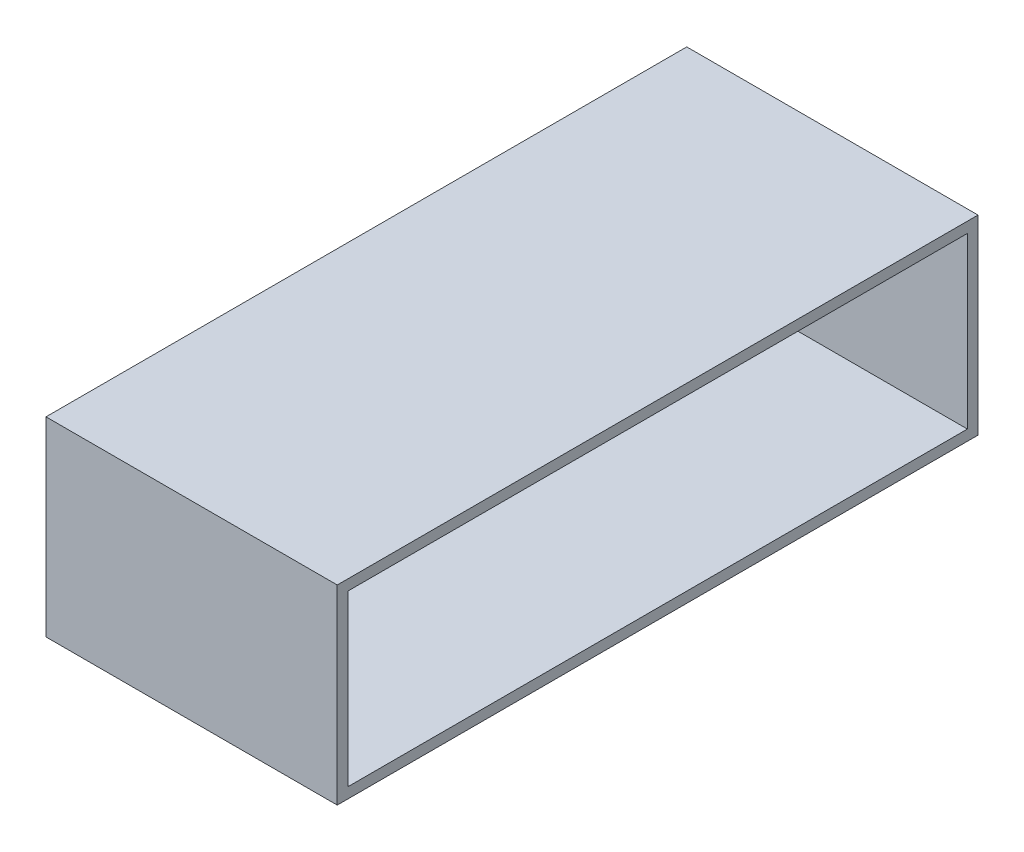
ISO-10303-21;
HEADER;
FILE_DESCRIPTION(('STEP AP214'),'2;1');
FILE_NAME('part.step','',(''),(''),'','','');
FILE_SCHEMA(('AUTOMOTIVE_DESIGN { 1 0 10303 214 1 1 1 1 }'));
ENDSEC;
DATA;
#1=APPLICATION_CONTEXT('core data for automotive mechanical design processes');
#2=APPLICATION_PROTOCOL_DEFINITION('international standard','automotive_design',2000,#1);
#3=PRODUCT_CONTEXT('',#1,'mechanical');
#4=PRODUCT('Part','Part','',(#3));
#5=PRODUCT_RELATED_PRODUCT_CATEGORY('part','',(#4));
#6=PRODUCT_DEFINITION_FORMATION('','',#4);
#7=PRODUCT_DEFINITION_CONTEXT('part definition',#1,'design');
#8=PRODUCT_DEFINITION('design','',#6,#7);
#9=PRODUCT_DEFINITION_SHAPE('','',#8);
#10=(LENGTH_UNIT() NAMED_UNIT(*) SI_UNIT(.MILLI.,.METRE.));
#11=(NAMED_UNIT(*) PLANE_ANGLE_UNIT() SI_UNIT($,.RADIAN.));
#12=(NAMED_UNIT(*) SI_UNIT($,.STERADIAN.) SOLID_ANGLE_UNIT());
#13=UNCERTAINTY_MEASURE_WITH_UNIT(LENGTH_MEASURE(1.E-05),#10,'distance_accuracy_value','');
#14=(GEOMETRIC_REPRESENTATION_CONTEXT(3) GLOBAL_UNCERTAINTY_ASSIGNED_CONTEXT((#13)) GLOBAL_UNIT_ASSIGNED_CONTEXT((#10,
#11,#12)) REPRESENTATION_CONTEXT('',''));
#15=CARTESIAN_POINT('',(0.,0.,0.));
#16=DIRECTION('',(0.,0.,1.));
#17=DIRECTION('',(1.,0.,0.));
#18=AXIS2_PLACEMENT_3D('',#15,#16,#17);
#19=CARTESIAN_POINT('',(0.,0.,0.));
#20=DIRECTION('',(-1.,0.,0.));
#21=DIRECTION('',(0.,0.,1.));
#22=AXIS2_PLACEMENT_3D('',#19,#20,#21);
#23=PLANE('',#22);
#24=DIRECTION('',(0.,1.,0.));
#25=VECTOR('',#24,1.);
#26=CARTESIAN_POINT('',(0.,-36.,-121.));
#27=LINE('',#26,#25);
#28=CARTESIAN_POINT('',(0.,-36.,-121.));
#29=VERTEX_POINT('',#28);
#30=CARTESIAN_POINT('',(0.,36.,-121.));
#31=VERTEX_POINT('',#30);
#32=EDGE_CURVE('E116',#29,#31,#27,.T.);
#33=ORIENTED_EDGE('',*,*,#32,.T.);
#34=DIRECTION('',(0.,0.,1.));
#35=VECTOR('',#34,1.);
#36=CARTESIAN_POINT('',(0.,36.,121.));
#37=LINE('',#36,#35);
#38=CARTESIAN_POINT('',(0.,36.,121.));
#39=VERTEX_POINT('',#38);
#40=EDGE_CURVE('E159',#31,#39,#37,.T.);
#41=ORIENTED_EDGE('',*,*,#40,.T.);
#42=DIRECTION('',(0.,-1.,0.));
#43=VECTOR('',#42,1.);
#44=CARTESIAN_POINT('',(0.,-36.,121.));
#45=LINE('',#44,#43);
#46=CARTESIAN_POINT('',(0.,-36.,121.));
#47=VERTEX_POINT('',#46);
#48=EDGE_CURVE('E162',#39,#47,#45,.T.);
#49=ORIENTED_EDGE('',*,*,#48,.T.);
#50=DIRECTION('',(0.,0.,-1.));
#51=VECTOR('',#50,1.);
#52=CARTESIAN_POINT('',(0.,-36.,121.));
#53=LINE('',#52,#51);
#54=EDGE_CURVE('E150',#47,#29,#53,.T.);
#55=ORIENTED_EDGE('',*,*,#54,.T.);
#56=EDGE_LOOP('',(#33,#41,#49,#55));
#57=FACE_BOUND('',#56,.T.);
#58=DIRECTION('',(0.,1.,0.));
#59=VECTOR('',#58,1.);
#60=CARTESIAN_POINT('',(0.,-36.,-117.));
#61=LINE('',#60,#59);
#62=CARTESIAN_POINT('',(0.,-32.,-117.));
#63=VERTEX_POINT('',#62);
#64=CARTESIAN_POINT('',(0.,32.,-117.));
#65=VERTEX_POINT('',#64);
#66=EDGE_CURVE('E140',#63,#65,#61,.T.);
#67=ORIENTED_EDGE('',*,*,#66,.F.);
#68=DIRECTION('',(0.,0.,-1.));
#69=VECTOR('',#68,1.);
#70=CARTESIAN_POINT('',(0.,-32.,121.));
#71=LINE('',#70,#69);
#72=CARTESIAN_POINT('',(0.,-32.,117.));
#73=VERTEX_POINT('',#72);
#74=EDGE_CURVE('E112',#73,#63,#71,.T.);
#75=ORIENTED_EDGE('',*,*,#74,.F.);
#76=DIRECTION('',(0.,-1.,0.));
#77=VECTOR('',#76,1.);
#78=CARTESIAN_POINT('',(0.,-36.,117.));
#79=LINE('',#78,#77);
#80=CARTESIAN_POINT('',(0.,32.,117.));
#81=VERTEX_POINT('',#80);
#82=EDGE_CURVE('E50',#81,#73,#79,.T.);
#83=ORIENTED_EDGE('',*,*,#82,.F.);
#84=DIRECTION('',(0.,0.,1.));
#85=VECTOR('',#84,1.);
#86=CARTESIAN_POINT('',(0.,32.,121.));
#87=LINE('',#86,#85);
#88=EDGE_CURVE('E142',#65,#81,#87,.T.);
#89=ORIENTED_EDGE('',*,*,#88,.F.);
#90=EDGE_LOOP('',(#67,#75,#83,#89));
#91=FACE_BOUND('',#90,.T.);
#92=ADVANCED_FACE('F33',(#57,#91),#23,.F.);
#93=CARTESIAN_POINT('',(-110.,-36.,-121.));
#94=DIRECTION('',(0.,0.,-1.));
#95=DIRECTION('',(-1.,0.,0.));
#96=AXIS2_PLACEMENT_3D('',#93,#94,#95);
#97=PLANE('',#96);
#98=ORIENTED_EDGE('',*,*,#32,.F.);
#99=DIRECTION('',(1.,0.,0.));
#100=VECTOR('',#99,1.);
#101=CARTESIAN_POINT('',(-110.,-36.,-121.));
#102=LINE('',#101,#100);
#103=CARTESIAN_POINT('',(-110.,-36.,-121.));
#104=VERTEX_POINT('',#103);
#105=EDGE_CURVE('E11',#104,#29,#102,.T.);
#106=ORIENTED_EDGE('',*,*,#105,.F.);
#107=DIRECTION('',(0.,1.,0.));
#108=VECTOR('',#107,1.);
#109=CARTESIAN_POINT('',(-110.,-36.,-121.));
#110=LINE('',#109,#108);
#111=CARTESIAN_POINT('',(-110.,36.,-121.));
#112=VERTEX_POINT('',#111);
#113=EDGE_CURVE('E147',#104,#112,#110,.T.);
#114=ORIENTED_EDGE('',*,*,#113,.T.);
#115=DIRECTION('',(1.,0.,0.));
#116=VECTOR('',#115,1.);
#117=CARTESIAN_POINT('',(-110.,36.,-121.));
#118=LINE('',#117,#116);
#119=EDGE_CURVE('E37',#112,#31,#118,.T.);
#120=ORIENTED_EDGE('',*,*,#119,.T.);
#121=EDGE_LOOP('',(#98,#106,#114,#120));
#122=FACE_BOUND('',#121,.T.);
#123=ADVANCED_FACE('F35',(#122),#97,.T.);
#124=CARTESIAN_POINT('',(-110.,-36.,121.));
#125=DIRECTION('',(0.,-1.,0.));
#126=DIRECTION('',(0.,0.,-1.));
#127=AXIS2_PLACEMENT_3D('',#124,#125,#126);
#128=PLANE('',#127);
#129=ORIENTED_EDGE('',*,*,#54,.F.);
#130=DIRECTION('',(1.,0.,0.));
#131=VECTOR('',#130,1.);
#132=CARTESIAN_POINT('',(-110.,-36.,121.));
#133=LINE('',#132,#131);
#134=CARTESIAN_POINT('',(-110.,-36.,121.));
#135=VERTEX_POINT('',#134);
#136=EDGE_CURVE('E42',#135,#47,#133,.T.);
#137=ORIENTED_EDGE('',*,*,#136,.F.);
#138=DIRECTION('',(0.,0.,-1.));
#139=VECTOR('',#138,1.);
#140=CARTESIAN_POINT('',(-110.,-36.,121.));
#141=LINE('',#140,#139);
#142=EDGE_CURVE('E155',#135,#104,#141,.T.);
#143=ORIENTED_EDGE('',*,*,#142,.T.);
#144=ORIENTED_EDGE('',*,*,#105,.T.);
#145=EDGE_LOOP('',(#129,#137,#143,#144));
#146=FACE_BOUND('',#145,.T.);
#147=ADVANCED_FACE('F172',(#146),#128,.T.);
#148=CARTESIAN_POINT('',(-110.,-36.,121.));
#149=DIRECTION('',(0.,0.,1.));
#150=DIRECTION('',(1.,0.,0.));
#151=AXIS2_PLACEMENT_3D('',#148,#149,#150);
#152=PLANE('',#151);
#153=ORIENTED_EDGE('',*,*,#48,.F.);
#154=DIRECTION('',(1.,0.,0.));
#155=VECTOR('',#154,1.);
#156=CARTESIAN_POINT('',(-110.,36.,121.));
#157=LINE('',#156,#155);
#158=CARTESIAN_POINT('',(-110.,36.,121.));
#159=VERTEX_POINT('',#158);
#160=EDGE_CURVE('E167',#159,#39,#157,.T.);
#161=ORIENTED_EDGE('',*,*,#160,.F.);
#162=DIRECTION('',(0.,-1.,0.));
#163=VECTOR('',#162,1.);
#164=CARTESIAN_POINT('',(-110.,-36.,121.));
#165=LINE('',#164,#163);
#166=EDGE_CURVE('E152',#159,#135,#165,.T.);
#167=ORIENTED_EDGE('',*,*,#166,.T.);
#168=ORIENTED_EDGE('',*,*,#136,.T.);
#169=EDGE_LOOP('',(#153,#161,#167,#168));
#170=FACE_BOUND('',#169,.T.);
#171=ADVANCED_FACE('F176',(#170),#152,.T.);
#172=CARTESIAN_POINT('',(-110.,36.,121.));
#173=DIRECTION('',(0.,1.,0.));
#174=DIRECTION('',(0.,0.,1.));
#175=AXIS2_PLACEMENT_3D('',#172,#173,#174);
#176=PLANE('',#175);
#177=ORIENTED_EDGE('',*,*,#40,.F.);
#178=ORIENTED_EDGE('',*,*,#119,.F.);
#179=DIRECTION('',(0.,0.,1.));
#180=VECTOR('',#179,1.);
#181=CARTESIAN_POINT('',(-110.,36.,121.));
#182=LINE('',#181,#180);
#183=EDGE_CURVE('E149',#112,#159,#182,.T.);
#184=ORIENTED_EDGE('',*,*,#183,.T.);
#185=ORIENTED_EDGE('',*,*,#160,.T.);
#186=EDGE_LOOP('',(#177,#178,#184,#185));
#187=FACE_BOUND('',#186,.T.);
#188=ADVANCED_FACE('F169',(#187),#176,.T.);
#189=CARTESIAN_POINT('',(-110.,0.,0.));
#190=DIRECTION('',(-1.,0.,0.));
#191=DIRECTION('',(0.,0.,1.));
#192=AXIS2_PLACEMENT_3D('',#189,#190,#191);
#193=PLANE('',#192);
#194=ORIENTED_EDGE('',*,*,#113,.F.);
#195=ORIENTED_EDGE('',*,*,#142,.F.);
#196=ORIENTED_EDGE('',*,*,#166,.F.);
#197=ORIENTED_EDGE('',*,*,#183,.F.);
#198=EDGE_LOOP('',(#194,#195,#196,#197));
#199=FACE_BOUND('',#198,.T.);
#200=ADVANCED_FACE('F178',(#199),#193,.T.);
#201=CARTESIAN_POINT('',(-110.,-36.,-117.));
#202=DIRECTION('',(0.,0.,-1.));
#203=DIRECTION('',(-1.,0.,0.));
#204=AXIS2_PLACEMENT_3D('',#201,#202,#203);
#205=PLANE('',#204);
#206=ORIENTED_EDGE('',*,*,#66,.T.);
#207=DIRECTION('',(1.,0.,0.));
#208=VECTOR('',#207,1.);
#209=CARTESIAN_POINT('',(-110.,32.,-117.));
#210=LINE('',#209,#208);
#211=CARTESIAN_POINT('',(-106.,32.,-117.));
#212=VERTEX_POINT('',#211);
#213=EDGE_CURVE('E122',#212,#65,#210,.T.);
#214=ORIENTED_EDGE('',*,*,#213,.F.);
#215=DIRECTION('',(0.,1.,0.));
#216=VECTOR('',#215,1.);
#217=CARTESIAN_POINT('',(-106.,-36.,-117.));
#218=LINE('',#217,#216);
#219=CARTESIAN_POINT('',(-106.,-32.,-117.));
#220=VERTEX_POINT('',#219);
#221=EDGE_CURVE('E120',#220,#212,#218,.T.);
#222=ORIENTED_EDGE('',*,*,#221,.F.);
#223=DIRECTION('',(1.,0.,0.));
#224=VECTOR('',#223,1.);
#225=CARTESIAN_POINT('',(-110.,-32.,-117.));
#226=LINE('',#225,#224);
#227=EDGE_CURVE('E106',#220,#63,#226,.T.);
#228=ORIENTED_EDGE('',*,*,#227,.T.);
#229=EDGE_LOOP('',(#206,#214,#222,#228));
#230=FACE_BOUND('',#229,.T.);
#231=ADVANCED_FACE('F121',(#230),#205,.F.);
#232=CARTESIAN_POINT('',(-110.,-32.,121.));
#233=DIRECTION('',(0.,-1.,0.));
#234=DIRECTION('',(0.,0.,-1.));
#235=AXIS2_PLACEMENT_3D('',#232,#233,#234);
#236=PLANE('',#235);
#237=ORIENTED_EDGE('',*,*,#74,.T.);
#238=ORIENTED_EDGE('',*,*,#227,.F.);
#239=DIRECTION('',(0.,0.,-1.));
#240=VECTOR('',#239,1.);
#241=CARTESIAN_POINT('',(-106.,-32.,121.));
#242=LINE('',#241,#240);
#243=CARTESIAN_POINT('',(-106.,-32.,117.));
#244=VERTEX_POINT('',#243);
#245=EDGE_CURVE('E110',#244,#220,#242,.T.);
#246=ORIENTED_EDGE('',*,*,#245,.F.);
#247=DIRECTION('',(1.,0.,0.));
#248=VECTOR('',#247,1.);
#249=CARTESIAN_POINT('',(-110.,-32.,117.));
#250=LINE('',#249,#248);
#251=EDGE_CURVE('E117',#244,#73,#250,.T.);
#252=ORIENTED_EDGE('',*,*,#251,.T.);
#253=EDGE_LOOP('',(#237,#238,#246,#252));
#254=FACE_BOUND('',#253,.T.);
#255=ADVANCED_FACE('F108',(#254),#236,.F.);
#256=CARTESIAN_POINT('',(-110.,-36.,117.));
#257=DIRECTION('',(0.,0.,1.));
#258=DIRECTION('',(1.,0.,0.));
#259=AXIS2_PLACEMENT_3D('',#256,#257,#258);
#260=PLANE('',#259);
#261=ORIENTED_EDGE('',*,*,#82,.T.);
#262=ORIENTED_EDGE('',*,*,#251,.F.);
#263=DIRECTION('',(0.,-1.,0.));
#264=VECTOR('',#263,1.);
#265=CARTESIAN_POINT('',(-106.,-36.,117.));
#266=LINE('',#265,#264);
#267=CARTESIAN_POINT('',(-106.,32.,117.));
#268=VERTEX_POINT('',#267);
#269=EDGE_CURVE('E131',#268,#244,#266,.T.);
#270=ORIENTED_EDGE('',*,*,#269,.F.);
#271=DIRECTION('',(1.,0.,0.));
#272=VECTOR('',#271,1.);
#273=CARTESIAN_POINT('',(-110.,32.,117.));
#274=LINE('',#273,#272);
#275=EDGE_CURVE('E133',#268,#81,#274,.T.);
#276=ORIENTED_EDGE('',*,*,#275,.T.);
#277=EDGE_LOOP('',(#261,#262,#270,#276));
#278=FACE_BOUND('',#277,.T.);
#279=ADVANCED_FACE('F227',(#278),#260,.F.);
#280=CARTESIAN_POINT('',(-110.,32.,121.));
#281=DIRECTION('',(0.,1.,0.));
#282=DIRECTION('',(0.,0.,1.));
#283=AXIS2_PLACEMENT_3D('',#280,#281,#282);
#284=PLANE('',#283);
#285=ORIENTED_EDGE('',*,*,#88,.T.);
#286=ORIENTED_EDGE('',*,*,#275,.F.);
#287=DIRECTION('',(0.,0.,1.));
#288=VECTOR('',#287,1.);
#289=CARTESIAN_POINT('',(-106.,32.,121.));
#290=LINE('',#289,#288);
#291=EDGE_CURVE('E126',#212,#268,#290,.T.);
#292=ORIENTED_EDGE('',*,*,#291,.F.);
#293=ORIENTED_EDGE('',*,*,#213,.T.);
#294=EDGE_LOOP('',(#285,#286,#292,#293));
#295=FACE_BOUND('',#294,.T.);
#296=ADVANCED_FACE('F236',(#295),#284,.F.);
#297=CARTESIAN_POINT('',(-106.,0.,0.));
#298=DIRECTION('',(-1.,0.,0.));
#299=DIRECTION('',(0.,0.,1.));
#300=AXIS2_PLACEMENT_3D('',#297,#298,#299);
#301=PLANE('',#300);
#302=ORIENTED_EDGE('',*,*,#221,.T.);
#303=ORIENTED_EDGE('',*,*,#291,.T.);
#304=ORIENTED_EDGE('',*,*,#269,.T.);
#305=ORIENTED_EDGE('',*,*,#245,.T.);
#306=EDGE_LOOP('',(#302,#303,#304,#305));
#307=FACE_BOUND('',#306,.T.);
#308=ADVANCED_FACE('F129',(#307),#301,.F.);
#309=CLOSED_SHELL('',(#92,#123,#147,#171,#188,#200,#231,#255,#279,#296,#308));
#310=MANIFOLD_SOLID_BREP('B2',#309);
#311=ADVANCED_BREP_SHAPE_REPRESENTATION('',(#18,#310),#14);
#312=SHAPE_DEFINITION_REPRESENTATION(#9,#311);
ENDSEC;
END-ISO-10303-21;
